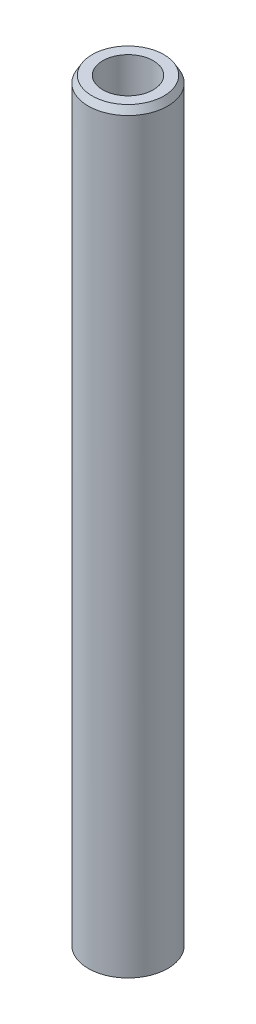
ISO-10303-21;
HEADER;
FILE_DESCRIPTION(('STEP AP214'),'2;1');
FILE_NAME('part.step','',(''),(''),'','','');
FILE_SCHEMA(('AUTOMOTIVE_DESIGN { 1 0 10303 214 1 1 1 1 }'));
ENDSEC;
DATA;
#1=APPLICATION_CONTEXT('core data for automotive mechanical design processes');
#2=APPLICATION_PROTOCOL_DEFINITION('international standard','automotive_design',2000,#1);
#3=PRODUCT_CONTEXT('',#1,'mechanical');
#4=PRODUCT('Part','Part','',(#3));
#5=PRODUCT_RELATED_PRODUCT_CATEGORY('part','',(#4));
#6=PRODUCT_DEFINITION_FORMATION('','',#4);
#7=PRODUCT_DEFINITION_CONTEXT('part definition',#1,'design');
#8=PRODUCT_DEFINITION('design','',#6,#7);
#9=PRODUCT_DEFINITION_SHAPE('','',#8);
#10=(LENGTH_UNIT() NAMED_UNIT(*) SI_UNIT(.MILLI.,.METRE.));
#11=(NAMED_UNIT(*) PLANE_ANGLE_UNIT() SI_UNIT($,.RADIAN.));
#12=(NAMED_UNIT(*) SI_UNIT($,.STERADIAN.) SOLID_ANGLE_UNIT());
#13=UNCERTAINTY_MEASURE_WITH_UNIT(LENGTH_MEASURE(1.E-05),#10,'distance_accuracy_value','');
#14=(GEOMETRIC_REPRESENTATION_CONTEXT(3) GLOBAL_UNCERTAINTY_ASSIGNED_CONTEXT((#13)) GLOBAL_UNIT_ASSIGNED_CONTEXT((#10,
#11,#12)) REPRESENTATION_CONTEXT('',''));
#15=CARTESIAN_POINT('',(0.,0.,0.));
#16=DIRECTION('',(0.,0.,1.));
#17=DIRECTION('',(1.,0.,0.));
#18=AXIS2_PLACEMENT_3D('',#15,#16,#17);
#19=CARTESIAN_POINT('',(0.,428.557441441678,0.));
#20=DIRECTION('',(0.,-1.,0.));
#21=DIRECTION('',(0.,0.,-1.));
#22=AXIS2_PLACEMENT_3D('',#19,#20,#21);
#23=CYLINDRICAL_SURFACE('',#22,22.5);
#24=CARTESIAN_POINT('',(0.,424.71381741387,0.));
#25=DIRECTION('',(0.,1.,0.));
#26=DIRECTION('',(0.,0.,1.));
#27=AXIS2_PLACEMENT_3D('',#24,#25,#26);
#28=CIRCLE('',#27,22.5);
#29=CARTESIAN_POINT('',(0.,424.71381741387,-22.5));
#30=VERTEX_POINT('',#29);
#31=EDGE_CURVE('E50',#30,#30,#28,.F.);
#32=ORIENTED_EDGE('',*,*,#31,.T.);
#33=EDGE_LOOP('',(#32));
#34=FACE_BOUND('',#33,.T.);
#35=CARTESIAN_POINT('',(0.,2.21911736711883,0.));
#36=DIRECTION('',(0.,1.,0.));
#37=DIRECTION('',(0.,0.,1.));
#38=AXIS2_PLACEMENT_3D('',#35,#36,#37);
#39=CIRCLE('',#38,22.5);
#40=CARTESIAN_POINT('',(0.,2.21911736711883,22.5));
#41=VERTEX_POINT('',#40);
#42=EDGE_CURVE('E51',#41,#41,#39,.T.);
#43=ORIENTED_EDGE('',*,*,#42,.T.);
#44=EDGE_LOOP('',(#43));
#45=FACE_BOUND('',#44,.T.);
#46=ADVANCED_FACE('F39',(#34,#45),#23,.T.);
#47=CARTESIAN_POINT('',(0.,428.557441441678,0.));
#48=DIRECTION('',(0.,1.,0.));
#49=DIRECTION('',(0.,0.,1.));
#50=AXIS2_PLACEMENT_3D('',#47,#48,#49);
#51=PLANE('',#50);
#52=CARTESIAN_POINT('',(0.,428.557441441678,0.));
#53=DIRECTION('',(0.,1.,0.));
#54=DIRECTION('',(0.,0.,1.));
#55=AXIS2_PLACEMENT_3D('',#52,#53,#54);
#56=CIRCLE('',#55,20.2808826328812);
#57=CARTESIAN_POINT('',(0.,428.557441441678,-20.2808826328812));
#58=VERTEX_POINT('',#57);
#59=EDGE_CURVE('E54',#58,#58,#56,.T.);
#60=ORIENTED_EDGE('',*,*,#59,.T.);
#61=EDGE_LOOP('',(#60));
#62=FACE_BOUND('',#61,.T.);
#63=CARTESIAN_POINT('',(0.,428.557441441678,0.));
#64=DIRECTION('',(0.,1.,0.));
#65=DIRECTION('',(0.,0.,1.));
#66=AXIS2_PLACEMENT_3D('',#63,#64,#65);
#67=CIRCLE('',#66,14.2928773380463);
#68=CARTESIAN_POINT('',(0.,428.557441441678,14.2928773380463));
#69=VERTEX_POINT('',#68);
#70=EDGE_CURVE('E58',#69,#69,#67,.T.);
#71=ORIENTED_EDGE('',*,*,#70,.F.);
#72=EDGE_LOOP('',(#71));
#73=FACE_BOUND('',#72,.T.);
#74=ADVANCED_FACE('F69',(#62,#73),#51,.T.);
#75=CARTESIAN_POINT('',(0.,0.,0.));
#76=DIRECTION('',(0.,1.,0.));
#77=DIRECTION('',(0.,0.,1.));
#78=AXIS2_PLACEMENT_3D('',#75,#76,#77);
#79=PLANE('',#78);
#80=CARTESIAN_POINT('',(0.,0.,0.));
#81=DIRECTION('',(0.,1.,0.));
#82=DIRECTION('',(0.,0.,1.));
#83=AXIS2_PLACEMENT_3D('',#80,#81,#82);
#84=CIRCLE('',#83,18.6563759721917);
#85=CARTESIAN_POINT('',(0.,0.,18.6563759721917));
#86=VERTEX_POINT('',#85);
#87=EDGE_CURVE('E10',#86,#86,#84,.F.);
#88=ORIENTED_EDGE('',*,*,#87,.T.);
#89=EDGE_LOOP('',(#88));
#90=FACE_BOUND('',#89,.T.);
#91=CARTESIAN_POINT('',(0.,0.,0.));
#92=DIRECTION('',(0.,1.,0.));
#93=DIRECTION('',(0.,0.,1.));
#94=AXIS2_PLACEMENT_3D('',#91,#92,#93);
#95=CIRCLE('',#94,14.2928773380463);
#96=CARTESIAN_POINT('',(0.,0.,14.2928773380463));
#97=VERTEX_POINT('',#96);
#98=EDGE_CURVE('E63',#97,#97,#95,.T.);
#99=ORIENTED_EDGE('',*,*,#98,.T.);
#100=EDGE_LOOP('',(#99));
#101=FACE_BOUND('',#100,.T.);
#102=ADVANCED_FACE('F75',(#90,#101),#79,.F.);
#103=CARTESIAN_POINT('',(0.,428.557441441678,0.));
#104=DIRECTION('',(0.,-1.,0.));
#105=DIRECTION('',(0.,0.,-1.));
#106=AXIS2_PLACEMENT_3D('',#103,#104,#105);
#107=CYLINDRICAL_SURFACE('',#106,14.2928773380463);
#108=ORIENTED_EDGE('',*,*,#70,.T.);
#109=EDGE_LOOP('',(#108));
#110=FACE_BOUND('',#109,.T.);
#111=ORIENTED_EDGE('',*,*,#98,.F.);
#112=EDGE_LOOP('',(#111));
#113=FACE_BOUND('',#112,.T.);
#114=ADVANCED_FACE('F70',(#110,#113),#107,.F.);
#115=CARTESIAN_POINT('',(0.,428.557441441678,0.));
#116=DIRECTION('',(0.,-1.,0.));
#117=DIRECTION('',(0.,0.,-1.));
#118=AXIS2_PLACEMENT_3D('',#115,#116,#117);
#119=CONICAL_SURFACE('',#118,20.2808826328812,0.523598775598293);
#120=CARTESIAN_POINT('',(0.,424.71381741387,-22.5));
#121=CARTESIAN_POINT('',(0.,424.75385516416,-22.4768841940925));
#122=CARTESIAN_POINT('',(0.,424.793892914449,-22.453768388185));
#123=CARTESIAN_POINT('',(0.,424.873968415029,-22.4075367763701));
#124=CARTESIAN_POINT('',(0.,424.914006165318,-22.3844209704626));
#125=CARTESIAN_POINT('',(0.,424.994081665898,-22.3381893586476));
#126=CARTESIAN_POINT('',(0.,425.034119416187,-22.3150735527401));
#127=CARTESIAN_POINT('',(0.,425.114194916767,-22.2688419409251));
#128=CARTESIAN_POINT('',(0.,425.154232667056,-22.2457261350176));
#129=CARTESIAN_POINT('',(0.,425.234308167636,-22.1994945232027));
#130=CARTESIAN_POINT('',(0.,425.274345917925,-22.1763787172952));
#131=CARTESIAN_POINT('',(0.,425.354421418505,-22.1301471054802));
#132=CARTESIAN_POINT('',(0.,425.394459168794,-22.1070312995727));
#133=CARTESIAN_POINT('',(0.,425.474534669374,-22.0607996877578));
#134=CARTESIAN_POINT('',(0.,425.514572419663,-22.0376838818503));
#135=CARTESIAN_POINT('',(0.,425.594647920243,-21.9914522700353));
#136=CARTESIAN_POINT('',(0.,425.634685670532,-21.9683364641278));
#137=CARTESIAN_POINT('',(0.,425.714761171112,-21.9221048523128));
#138=CARTESIAN_POINT('',(0.,425.754798921401,-21.8989890464053));
#139=CARTESIAN_POINT('',(0.,425.834874421981,-21.8527574345904));
#140=CARTESIAN_POINT('',(0.,425.87491217227,-21.8296416286829));
#141=CARTESIAN_POINT('',(0.,425.95498767285,-21.7834100168679));
#142=CARTESIAN_POINT('',(0.,425.99502542314,-21.7602942109604));
#143=CARTESIAN_POINT('',(0.,426.075100923719,-21.7140625991454));
#144=CARTESIAN_POINT('',(0.,426.115138674008,-21.6909467932379));
#145=CARTESIAN_POINT('',(0.,426.195214174588,-21.644715181423));
#146=CARTESIAN_POINT('',(0.,426.235251924878,-21.6215993755155));
#147=CARTESIAN_POINT('',(0.,426.315327425457,-21.5753677637005));
#148=CARTESIAN_POINT('',(0.,426.355365175746,-21.552251957793));
#149=CARTESIAN_POINT('',(0.,426.435440676326,-21.506020345978));
#150=CARTESIAN_POINT('',(0.,426.475478426616,-21.4829045400706));
#151=CARTESIAN_POINT('',(0.,426.555553927195,-21.4366729282556));
#152=CARTESIAN_POINT('',(0.,426.595591677484,-21.4135571223481));
#153=CARTESIAN_POINT('',(0.,426.675667178064,-21.3673255105331));
#154=CARTESIAN_POINT('',(0.,426.715704928354,-21.3442097046256));
#155=CARTESIAN_POINT('',(0.,426.795780428933,-21.2979780928106));
#156=CARTESIAN_POINT('',(0.,426.835818179223,-21.2748622869032));
#157=CARTESIAN_POINT('',(0.,426.915893679802,-21.2286306750882));
#158=CARTESIAN_POINT('',(0.,426.955931430092,-21.2055148691807));
#159=CARTESIAN_POINT('',(0.,427.036006930671,-21.1592832573657));
#160=CARTESIAN_POINT('',(0.,427.076044680961,-21.1361674514582));
#161=CARTESIAN_POINT('',(0.,427.15612018154,-21.0899358396432));
#162=CARTESIAN_POINT('',(0.,427.19615793183,-21.0668200337358));
#163=CARTESIAN_POINT('',(0.,427.276233432409,-21.0205884219208));
#164=CARTESIAN_POINT('',(0.,427.316271182699,-20.9974726160133));
#165=CARTESIAN_POINT('',(0.,427.396346683278,-20.9512410041983));
#166=CARTESIAN_POINT('',(0.,427.436384433568,-20.9281251982908));
#167=CARTESIAN_POINT('',(0.,427.516459934147,-20.8818935864759));
#168=CARTESIAN_POINT('',(0.,427.556497684437,-20.8587777805684));
#169=CARTESIAN_POINT('',(0.,427.636573185016,-20.8125461687534));
#170=CARTESIAN_POINT('',(0.,427.676610935306,-20.7894303628459));
#171=CARTESIAN_POINT('',(0.,427.756686435885,-20.7431987510309));
#172=CARTESIAN_POINT('',(0.,427.796724186175,-20.7200829451234));
#173=CARTESIAN_POINT('',(0.,427.876799686754,-20.6738513333085));
#174=CARTESIAN_POINT('',(0.,427.916837437044,-20.650735527401));
#175=CARTESIAN_POINT('',(0.,427.996912937623,-20.604503915586));
#176=CARTESIAN_POINT('',(0.,428.036950687913,-20.5813881096785));
#177=CARTESIAN_POINT('',(0.,428.117026188492,-20.5351564978635));
#178=CARTESIAN_POINT('',(0.,428.157063938782,-20.5120406919561));
#179=CARTESIAN_POINT('',(0.,428.237139439361,-20.4658090801411));
#180=CARTESIAN_POINT('',(0.,428.277177189651,-20.4426932742336));
#181=CARTESIAN_POINT('',(0.,428.35725269023,-20.3964616624186));
#182=CARTESIAN_POINT('',(0.,428.39729044052,-20.3733458565111));
#183=CARTESIAN_POINT('',(0.,428.477365941099,-20.3271142446962));
#184=CARTESIAN_POINT('',(0.,428.517403691389,-20.3039984387887));
#185=CARTESIAN_POINT('',(0.,428.557441441678,-20.2808826328812));
#186=B_SPLINE_CURVE_WITH_KNOTS('',3,(#120,#121,#122,#123,#124,#125,#126,#127,#128,#129,#130,
#131,#132,#133,#134,#135,#136,#137,#138,#139,#140,#141,#142,#143,#144,#145,#146,#147,#148,#149,
#150,#151,#152,#153,#154,#155,#156,#157,#158,#159,#160,#161,#162,#163,#164,#165,#166,#167,#168,
#169,#170,#171,#172,#173,#174,#175,#176,#177,#178,#179,#180,#181,#182,#183,#184,#185),
.UNSPECIFIED.,.F.,.F.,(4,2,2,2,2,2,2,2,2,2,2,2,2,2,2,2,2,2,2,2,2,2,2,2,2,2,2,2,2,2,2,2,4),(0.,
0.138694835444942,0.277389670889883,0.416084506334823,0.554779341779716,0.693474177224656,
0.832169012669598,0.970863848114537,1.10955868355943,1.24825351900437,1.38694835444931,
1.52564318989425,1.66433802533915,1.80303286078409,1.94172769622903,2.08042253167397,
2.21911736711886,2.3578122025638,2.49650703800874,2.63520187345368,2.77389670889858,
2.91259154434352,3.05128637978846,3.1899812152334,3.32867605067834,3.46737088612323,
3.60606572156817,3.74476055701311,3.88345539245805,4.02215022790295,4.16084506334789,
4.29953989879283,4.43823473423777),.UNSPECIFIED.);
#187=EDGE_CURVE('BSEAM81',#30,#58,#186,.T.);
#188=ORIENTED_EDGE('',*,*,#31,.F.);
#189=ORIENTED_EDGE('',*,*,#59,.F.);
#190=ORIENTED_EDGE('',*,*,#187,.T.);
#191=ORIENTED_EDGE('',*,*,#187,.F.);
#192=EDGE_LOOP('',(#188,#190,#189,#191));
#193=FACE_BOUND('',#192,.T.);
#194=ADVANCED_FACE('F81',(#193),#119,.T.);
#195=CARTESIAN_POINT('',(0.,2.21911736711883,0.));
#196=DIRECTION('',(0.,1.,0.));
#197=DIRECTION('',(0.,0.,1.));
#198=AXIS2_PLACEMENT_3D('',#195,#196,#197);
#199=CONICAL_SURFACE('',#198,22.5,1.0471975511966);
#200=ORIENTED_EDGE('',*,*,#87,.F.);
#201=EDGE_LOOP('',(#200));
#202=FACE_BOUND('',#201,.T.);
#203=ORIENTED_EDGE('',*,*,#42,.F.);
#204=EDGE_LOOP('',(#203));
#205=FACE_BOUND('',#204,.T.);
#206=ADVANCED_FACE('F45',(#202,#205),#199,.T.);
#207=CLOSED_SHELL('',(#46,#74,#102,#114,#194,#206));
#208=MANIFOLD_SOLID_BREP('B2',#207);
#209=ADVANCED_BREP_SHAPE_REPRESENTATION('',(#18,#208),#14);
#210=SHAPE_DEFINITION_REPRESENTATION(#9,#209);
ENDSEC;
END-ISO-10303-21;
